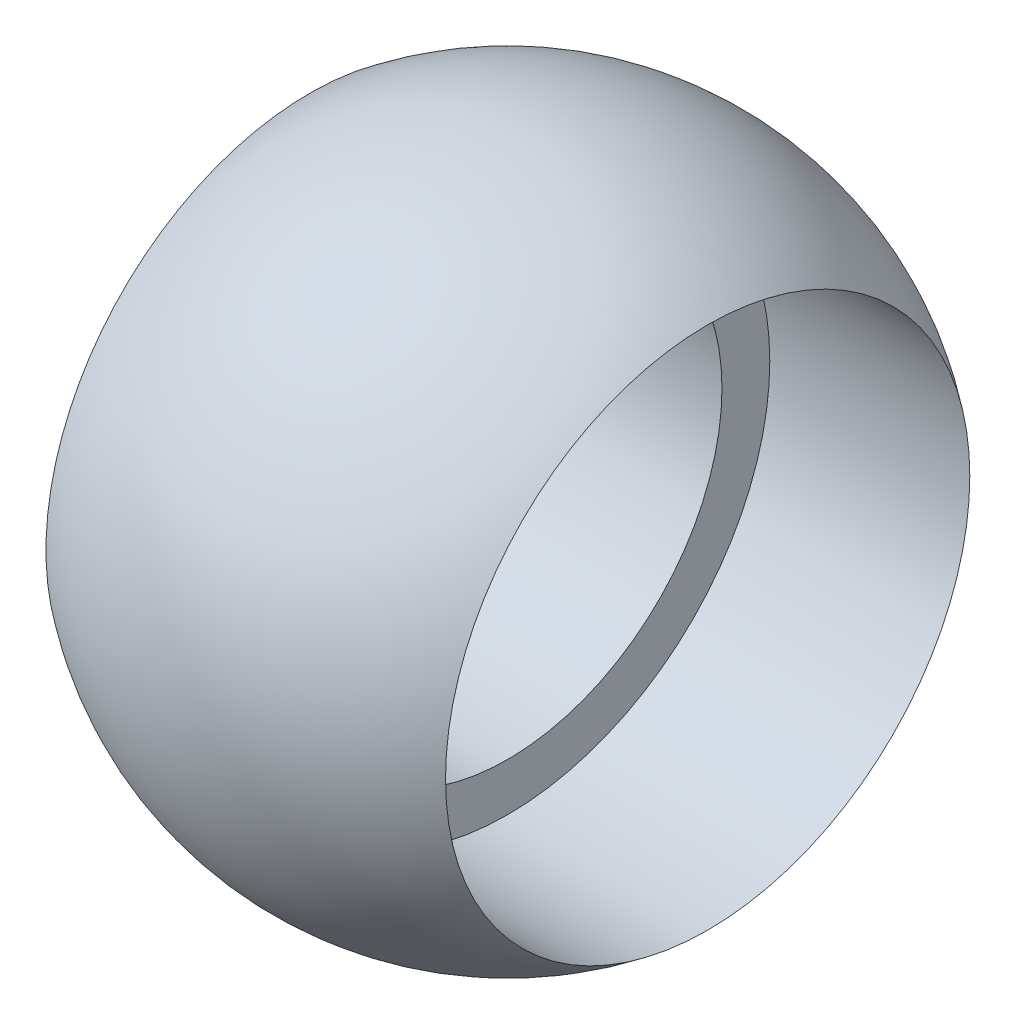
ISO-10303-21;
HEADER;
FILE_DESCRIPTION(('STEP AP214'),'2;1');
FILE_NAME('part.step','',(''),(''),'','','');
FILE_SCHEMA(('AUTOMOTIVE_DESIGN { 1 0 10303 214 1 1 1 1 }'));
ENDSEC;
DATA;
#1=APPLICATION_CONTEXT('core data for automotive mechanical design processes');
#2=APPLICATION_PROTOCOL_DEFINITION('international standard','automotive_design',2000,#1);
#3=PRODUCT_CONTEXT('',#1,'mechanical');
#4=PRODUCT('Part','Part','',(#3));
#5=PRODUCT_RELATED_PRODUCT_CATEGORY('part','',(#4));
#6=PRODUCT_DEFINITION_FORMATION('','',#4);
#7=PRODUCT_DEFINITION_CONTEXT('part definition',#1,'design');
#8=PRODUCT_DEFINITION('design','',#6,#7);
#9=PRODUCT_DEFINITION_SHAPE('','',#8);
#10=(LENGTH_UNIT() NAMED_UNIT(*) SI_UNIT(.MILLI.,.METRE.));
#11=(NAMED_UNIT(*) PLANE_ANGLE_UNIT() SI_UNIT($,.RADIAN.));
#12=(NAMED_UNIT(*) SI_UNIT($,.STERADIAN.) SOLID_ANGLE_UNIT());
#13=UNCERTAINTY_MEASURE_WITH_UNIT(LENGTH_MEASURE(1.E-05),#10,'distance_accuracy_value','');
#14=(GEOMETRIC_REPRESENTATION_CONTEXT(3) GLOBAL_UNCERTAINTY_ASSIGNED_CONTEXT((#13)) GLOBAL_UNIT_ASSIGNED_CONTEXT((#10,
#11,#12)) REPRESENTATION_CONTEXT('',''));
#15=CARTESIAN_POINT('',(0.,0.,0.));
#16=DIRECTION('',(0.,0.,1.));
#17=DIRECTION('',(1.,0.,0.));
#18=AXIS2_PLACEMENT_3D('',#15,#16,#17);
#19=CARTESIAN_POINT('',(0.,0.,0.));
#20=DIRECTION('',(0.,0.,1.));
#21=DIRECTION('',(0.,1.,0.));
#22=AXIS2_PLACEMENT_3D('',#19,#20,#21);
#23=SPHERICAL_SURFACE('',#22,20.);
#24=CARTESIAN_POINT('',(0.,0.,0.));
#25=DIRECTION('',(1.,0.,0.));
#26=DIRECTION('',(0.,0.,-1.));
#27=AXIS2_PLACEMENT_3D('',#24,#25,#26);
#28=SPHERICAL_SURFACE('',#27,20.);
#29=CARTESIAN_POINT('',(-12.0051313456008,0.,0.));
#30=DIRECTION('',(1.,0.,0.));
#31=DIRECTION('',(0.,0.,-1.));
#32=AXIS2_PLACEMENT_3D('',#29,#30,#31);
#33=CIRCLE('',#32,15.9961502048109);
#34=CARTESIAN_POINT('',(-12.0051313456008,0.,-15.9961502048109));
#35=VERTEX_POINT('',#34);
#36=EDGE_CURVE('E10',#35,#35,#33,.T.);
#37=ORIENTED_EDGE('',*,*,#36,.T.);
#38=EDGE_LOOP('',(#37));
#39=FACE_BOUND('',#38,.T.);
#40=CARTESIAN_POINT('',(12.1321885906872,0.,0.));
#41=DIRECTION('',(-1.,0.,0.));
#42=DIRECTION('',(0.,0.,1.));
#43=AXIS2_PLACEMENT_3D('',#40,#41,#42);
#44=CIRCLE('',#43,15.9);
#45=CARTESIAN_POINT('',(12.1321885906872,0.,15.9));
#46=VERTEX_POINT('',#45);
#47=EDGE_CURVE('E42',#46,#46,#44,.F.);
#48=ORIENTED_EDGE('',*,*,#47,.F.);
#49=EDGE_LOOP('',(#48));
#50=FACE_BOUND('',#49,.T.);
#51=ADVANCED_FACE('F39',(#39,#50),#28,.T.);
#52=CARTESIAN_POINT('',(-50.,0.,0.));
#53=DIRECTION('',(1.,0.,0.));
#54=DIRECTION('',(0.,0.,-1.));
#55=AXIS2_PLACEMENT_3D('',#52,#53,#54);
#56=CYLINDRICAL_SURFACE('',#55,13.);
#57=CARTESIAN_POINT('',(-12.,0.,0.));
#58=DIRECTION('',(1.,0.,0.));
#59=DIRECTION('',(0.,0.,-1.));
#60=AXIS2_PLACEMENT_3D('',#57,#58,#59);
#61=CIRCLE('',#60,13.);
#62=CARTESIAN_POINT('',(-12.,0.,-13.));
#63=VERTEX_POINT('',#62);
#64=EDGE_CURVE('E46',#63,#63,#61,.F.);
#65=ORIENTED_EDGE('',*,*,#64,.T.);
#66=EDGE_LOOP('',(#65));
#67=FACE_BOUND('',#66,.T.);
#68=CARTESIAN_POINT('',(0.,0.,0.));
#69=DIRECTION('',(1.,0.,0.));
#70=DIRECTION('',(0.,0.,-1.));
#71=AXIS2_PLACEMENT_3D('',#68,#69,#70);
#72=CIRCLE('',#71,13.);
#73=CARTESIAN_POINT('',(0.,0.,-13.));
#74=VERTEX_POINT('',#73);
#75=EDGE_CURVE('E54',#74,#74,#72,.F.);
#76=ORIENTED_EDGE('',*,*,#75,.F.);
#77=EDGE_LOOP('',(#76));
#78=FACE_BOUND('',#77,.T.);
#79=ADVANCED_FACE('F77',(#67,#78),#56,.F.);
#80=CARTESIAN_POINT('',(-37.,0.,0.));
#81=DIRECTION('',(1.,0.,0.));
#82=DIRECTION('',(0.,0.,-1.));
#83=AXIS2_PLACEMENT_3D('',#80,#81,#82);
#84=CYLINDRICAL_SURFACE('',#83,15.9961502048109);
#85=CARTESIAN_POINT('',(-12.,0.,0.));
#86=DIRECTION('',(1.,0.,0.));
#87=DIRECTION('',(0.,0.,-1.));
#88=AXIS2_PLACEMENT_3D('',#85,#86,#87);
#89=CIRCLE('',#88,15.9961502048109);
#90=CARTESIAN_POINT('',(-12.,0.,-15.9961502048109));
#91=VERTEX_POINT('',#90);
#92=EDGE_CURVE('E51',#91,#91,#89,.T.);
#93=ORIENTED_EDGE('',*,*,#92,.T.);
#94=EDGE_LOOP('',(#93));
#95=FACE_BOUND('',#94,.T.);
#96=ORIENTED_EDGE('',*,*,#36,.F.);
#97=EDGE_LOOP('',(#96));
#98=FACE_BOUND('',#97,.T.);
#99=ADVANCED_FACE('F67',(#95,#98),#84,.F.);
#100=CARTESIAN_POINT('',(-12.,0.,0.));
#101=DIRECTION('',(1.,0.,0.));
#102=DIRECTION('',(0.,0.,-1.));
#103=AXIS2_PLACEMENT_3D('',#100,#101,#102);
#104=PLANE('',#103);
#105=ORIENTED_EDGE('',*,*,#92,.F.);
#106=EDGE_LOOP('',(#105));
#107=FACE_BOUND('',#106,.T.);
#108=ORIENTED_EDGE('',*,*,#64,.F.);
#109=EDGE_LOOP('',(#108));
#110=FACE_BOUND('',#109,.T.);
#111=ADVANCED_FACE('F70',(#107,#110),#104,.F.);
#112=CARTESIAN_POINT('',(25.,0.,0.));
#113=DIRECTION('',(-1.,0.,0.));
#114=DIRECTION('',(0.,0.,1.));
#115=AXIS2_PLACEMENT_3D('',#112,#113,#114);
#116=CYLINDRICAL_SURFACE('',#115,15.9);
#117=CARTESIAN_POINT('',(0.,0.,0.));
#118=DIRECTION('',(1.,0.,0.));
#119=DIRECTION('',(0.,0.,-1.));
#120=AXIS2_PLACEMENT_3D('',#117,#118,#119);
#121=CIRCLE('',#120,15.9);
#122=CARTESIAN_POINT('',(0.,0.,-15.9));
#123=VERTEX_POINT('',#122);
#124=EDGE_CURVE('E56',#123,#123,#121,.T.);
#125=ORIENTED_EDGE('',*,*,#124,.F.);
#126=EDGE_LOOP('',(#125));
#127=FACE_BOUND('',#126,.T.);
#128=ORIENTED_EDGE('',*,*,#47,.T.);
#129=EDGE_LOOP('',(#128));
#130=FACE_BOUND('',#129,.T.);
#131=ADVANCED_FACE('F73',(#127,#130),#116,.F.);
#132=CARTESIAN_POINT('',(0.,0.,0.));
#133=DIRECTION('',(1.,0.,0.));
#134=DIRECTION('',(0.,0.,-1.));
#135=AXIS2_PLACEMENT_3D('',#132,#133,#134);
#136=PLANE('',#135);
#137=ORIENTED_EDGE('',*,*,#124,.T.);
#138=EDGE_LOOP('',(#137));
#139=FACE_BOUND('',#138,.T.);
#140=ORIENTED_EDGE('',*,*,#75,.T.);
#141=EDGE_LOOP('',(#140));
#142=FACE_BOUND('',#141,.T.);
#143=ADVANCED_FACE('F88',(#139,#142),#136,.T.);
#144=CLOSED_SHELL('',(#51,#79,#99,#111,#131,#143));
#145=MANIFOLD_SOLID_BREP('B2',#144);
#146=ADVANCED_BREP_SHAPE_REPRESENTATION('',(#18,#145),#14);
#147=SHAPE_DEFINITION_REPRESENTATION(#9,#146);
ENDSEC;
END-ISO-10303-21;
